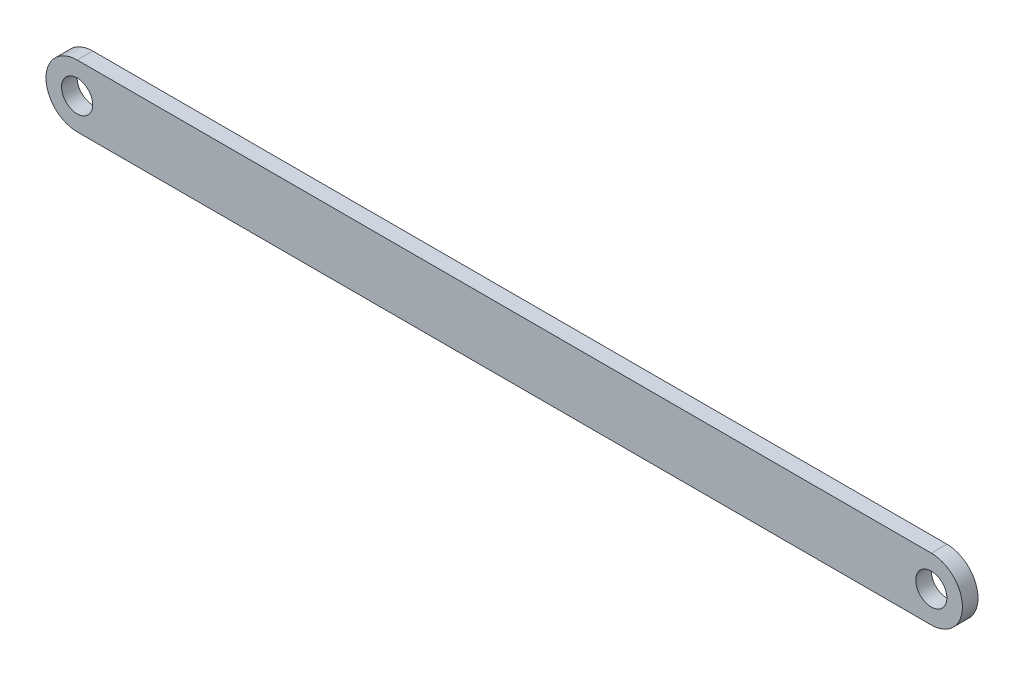
ISO-10303-21;
HEADER;
FILE_DESCRIPTION(('STEP AP214'),'2;1');
FILE_NAME('part.step','',(''),(''),'','','');
FILE_SCHEMA(('AUTOMOTIVE_DESIGN { 1 0 10303 214 1 1 1 1 }'));
ENDSEC;
DATA;
#1=APPLICATION_CONTEXT('core data for automotive mechanical design processes');
#2=APPLICATION_PROTOCOL_DEFINITION('international standard','automotive_design',2000,#1);
#3=PRODUCT_CONTEXT('',#1,'mechanical');
#4=PRODUCT('Part','Part','',(#3));
#5=PRODUCT_RELATED_PRODUCT_CATEGORY('part','',(#4));
#6=PRODUCT_DEFINITION_FORMATION('','',#4);
#7=PRODUCT_DEFINITION_CONTEXT('part definition',#1,'design');
#8=PRODUCT_DEFINITION('design','',#6,#7);
#9=PRODUCT_DEFINITION_SHAPE('','',#8);
#10=(LENGTH_UNIT() NAMED_UNIT(*) SI_UNIT(.MILLI.,.METRE.));
#11=(NAMED_UNIT(*) PLANE_ANGLE_UNIT() SI_UNIT($,.RADIAN.));
#12=(NAMED_UNIT(*) SI_UNIT($,.STERADIAN.) SOLID_ANGLE_UNIT());
#13=UNCERTAINTY_MEASURE_WITH_UNIT(LENGTH_MEASURE(1.E-05),#10,'distance_accuracy_value','');
#14=(GEOMETRIC_REPRESENTATION_CONTEXT(3) GLOBAL_UNCERTAINTY_ASSIGNED_CONTEXT((#13)) GLOBAL_UNIT_ASSIGNED_CONTEXT((#10,
#11,#12)) REPRESENTATION_CONTEXT('',''));
#15=CARTESIAN_POINT('',(0.,0.,0.));
#16=DIRECTION('',(0.,0.,1.));
#17=DIRECTION('',(1.,0.,0.));
#18=AXIS2_PLACEMENT_3D('',#15,#16,#17);
#19=CARTESIAN_POINT('',(27.435,0.,1.));
#20=DIRECTION('',(0.,0.,-1.));
#21=DIRECTION('',(-1.,0.,0.));
#22=AXIS2_PLACEMENT_3D('',#19,#20,#21);
#23=PLANE('',#22);
#24=CARTESIAN_POINT('',(27.435,0.,1.));
#25=DIRECTION('',(0.,0.,1.));
#26=DIRECTION('',(-1.,0.,0.));
#27=AXIS2_PLACEMENT_3D('',#24,#25,#26);
#28=CIRCLE('',#27,2.);
#29=CARTESIAN_POINT('',(27.435,-2.,1.));
#30=VERTEX_POINT('',#29);
#31=CARTESIAN_POINT('',(27.435,2.,1.));
#32=VERTEX_POINT('',#31);
#33=EDGE_CURVE('E96',#30,#32,#28,.T.);
#34=ORIENTED_EDGE('',*,*,#33,.T.);
#35=DIRECTION('',(-1.,0.,0.));
#36=VECTOR('',#35,1.);
#37=CARTESIAN_POINT('',(-27.435,2.,1.));
#38=LINE('',#37,#36);
#39=CARTESIAN_POINT('',(-27.435,2.,1.));
#40=VERTEX_POINT('',#39);
#41=EDGE_CURVE('E91',#32,#40,#38,.T.);
#42=ORIENTED_EDGE('',*,*,#41,.T.);
#43=CARTESIAN_POINT('',(-27.435,0.,1.));
#44=DIRECTION('',(0.,0.,1.));
#45=DIRECTION('',(1.,0.,0.));
#46=AXIS2_PLACEMENT_3D('',#43,#44,#45);
#47=CIRCLE('',#46,2.);
#48=CARTESIAN_POINT('',(-27.435,-2.,1.));
#49=VERTEX_POINT('',#48);
#50=EDGE_CURVE('E94',#40,#49,#47,.T.);
#51=ORIENTED_EDGE('',*,*,#50,.T.);
#52=DIRECTION('',(1.,0.,0.));
#53=VECTOR('',#52,1.);
#54=CARTESIAN_POINT('',(-27.435,-2.,1.));
#55=LINE('',#54,#53);
#56=EDGE_CURVE('E61',#49,#30,#55,.T.);
#57=ORIENTED_EDGE('',*,*,#56,.T.);
#58=EDGE_LOOP('',(#34,#42,#51,#57));
#59=FACE_BOUND('',#58,.T.);
#60=CARTESIAN_POINT('',(-27.435,0.,1.));
#61=DIRECTION('',(0.,0.,1.));
#62=DIRECTION('',(1.,0.,0.));
#63=AXIS2_PLACEMENT_3D('',#60,#61,#62);
#64=CIRCLE('',#63,1.);
#65=CARTESIAN_POINT('',(-26.435,0.,1.));
#66=VERTEX_POINT('',#65);
#67=EDGE_CURVE('E116',#66,#66,#64,.T.);
#68=ORIENTED_EDGE('',*,*,#67,.F.);
#69=EDGE_LOOP('',(#68));
#70=FACE_BOUND('',#69,.T.);
#71=CARTESIAN_POINT('',(27.435,0.,1.));
#72=DIRECTION('',(0.,0.,1.));
#73=DIRECTION('',(1.,0.,0.));
#74=AXIS2_PLACEMENT_3D('',#71,#72,#73);
#75=CIRCLE('',#74,1.);
#76=CARTESIAN_POINT('',(28.435,0.,1.));
#77=VERTEX_POINT('',#76);
#78=EDGE_CURVE('E138',#77,#77,#75,.T.);
#79=ORIENTED_EDGE('',*,*,#78,.F.);
#80=EDGE_LOOP('',(#79));
#81=FACE_BOUND('',#80,.T.);
#82=ADVANCED_FACE('F43',(#59,#70,#81),#23,.F.);
#83=CARTESIAN_POINT('',(27.435,0.,0.));
#84=DIRECTION('',(0.,0.,-1.));
#85=DIRECTION('',(-1.,0.,0.));
#86=AXIS2_PLACEMENT_3D('',#83,#84,#85);
#87=PLANE('',#86);
#88=CARTESIAN_POINT('',(-27.435,0.,0.));
#89=DIRECTION('',(0.,0.,1.));
#90=DIRECTION('',(1.,0.,0.));
#91=AXIS2_PLACEMENT_3D('',#88,#89,#90);
#92=CIRCLE('',#91,1.);
#93=CARTESIAN_POINT('',(-26.435,0.,0.));
#94=VERTEX_POINT('',#93);
#95=EDGE_CURVE('E134',#94,#94,#92,.T.);
#96=ORIENTED_EDGE('',*,*,#95,.T.);
#97=EDGE_LOOP('',(#96));
#98=FACE_BOUND('',#97,.T.);
#99=CARTESIAN_POINT('',(27.435,0.,0.));
#100=DIRECTION('',(0.,0.,1.));
#101=DIRECTION('',(-1.,0.,0.));
#102=AXIS2_PLACEMENT_3D('',#99,#100,#101);
#103=CIRCLE('',#102,2.);
#104=CARTESIAN_POINT('',(27.435,-2.,0.));
#105=VERTEX_POINT('',#104);
#106=CARTESIAN_POINT('',(27.435,2.,0.));
#107=VERTEX_POINT('',#106);
#108=EDGE_CURVE('E112',#105,#107,#103,.T.);
#109=ORIENTED_EDGE('',*,*,#108,.F.);
#110=DIRECTION('',(1.,0.,0.));
#111=VECTOR('',#110,1.);
#112=CARTESIAN_POINT('',(-27.435,-2.,0.));
#113=LINE('',#112,#111);
#114=CARTESIAN_POINT('',(-27.435,-2.,0.));
#115=VERTEX_POINT('',#114);
#116=EDGE_CURVE('E84',#115,#105,#113,.T.);
#117=ORIENTED_EDGE('',*,*,#116,.F.);
#118=CARTESIAN_POINT('',(-27.435,0.,0.));
#119=DIRECTION('',(0.,0.,1.));
#120=DIRECTION('',(1.,0.,0.));
#121=AXIS2_PLACEMENT_3D('',#118,#119,#120);
#122=CIRCLE('',#121,2.);
#123=CARTESIAN_POINT('',(-27.435,2.,0.));
#124=VERTEX_POINT('',#123);
#125=EDGE_CURVE('E78',#124,#115,#122,.T.);
#126=ORIENTED_EDGE('',*,*,#125,.F.);
#127=DIRECTION('',(-1.,0.,0.));
#128=VECTOR('',#127,1.);
#129=CARTESIAN_POINT('',(-27.435,2.,0.));
#130=LINE('',#129,#128);
#131=EDGE_CURVE('E101',#107,#124,#130,.T.);
#132=ORIENTED_EDGE('',*,*,#131,.F.);
#133=EDGE_LOOP('',(#109,#117,#126,#132));
#134=FACE_BOUND('',#133,.T.);
#135=CARTESIAN_POINT('',(27.435,0.,0.));
#136=DIRECTION('',(0.,0.,1.));
#137=DIRECTION('',(1.,0.,0.));
#138=AXIS2_PLACEMENT_3D('',#135,#136,#137);
#139=CIRCLE('',#138,1.);
#140=CARTESIAN_POINT('',(28.435,0.,0.));
#141=VERTEX_POINT('',#140);
#142=EDGE_CURVE('E142',#141,#141,#139,.T.);
#143=ORIENTED_EDGE('',*,*,#142,.T.);
#144=EDGE_LOOP('',(#143));
#145=FACE_BOUND('',#144,.T.);
#146=ADVANCED_FACE('F129',(#98,#134,#145),#87,.T.);
#147=CARTESIAN_POINT('',(27.435,0.,1.));
#148=DIRECTION('',(0.,0.,-1.));
#149=DIRECTION('',(-1.,0.,0.));
#150=AXIS2_PLACEMENT_3D('',#147,#148,#149);
#151=CYLINDRICAL_SURFACE('',#150,2.);
#152=ORIENTED_EDGE('',*,*,#108,.T.);
#153=DIRECTION('',(0.,0.,-1.));
#154=VECTOR('',#153,1.);
#155=CARTESIAN_POINT('',(27.435,2.,1.));
#156=LINE('',#155,#154);
#157=EDGE_CURVE('E11',#32,#107,#156,.T.);
#158=ORIENTED_EDGE('',*,*,#157,.F.);
#159=ORIENTED_EDGE('',*,*,#33,.F.);
#160=DIRECTION('',(0.,0.,-1.));
#161=VECTOR('',#160,1.);
#162=CARTESIAN_POINT('',(27.435,-2.,1.));
#163=LINE('',#162,#161);
#164=EDGE_CURVE('E108',#30,#105,#163,.T.);
#165=ORIENTED_EDGE('',*,*,#164,.T.);
#166=EDGE_LOOP('',(#152,#158,#159,#165));
#167=FACE_BOUND('',#166,.T.);
#168=ADVANCED_FACE('F45',(#167),#151,.T.);
#169=CARTESIAN_POINT('',(-27.435,2.,1.));
#170=DIRECTION('',(0.,-1.,0.));
#171=DIRECTION('',(0.,0.,-1.));
#172=AXIS2_PLACEMENT_3D('',#169,#170,#171);
#173=PLANE('',#172);
#174=ORIENTED_EDGE('',*,*,#131,.T.);
#175=DIRECTION('',(0.,0.,-1.));
#176=VECTOR('',#175,1.);
#177=CARTESIAN_POINT('',(-27.435,2.,1.));
#178=LINE('',#177,#176);
#179=EDGE_CURVE('E53',#40,#124,#178,.T.);
#180=ORIENTED_EDGE('',*,*,#179,.F.);
#181=ORIENTED_EDGE('',*,*,#41,.F.);
#182=ORIENTED_EDGE('',*,*,#157,.T.);
#183=EDGE_LOOP('',(#174,#180,#181,#182));
#184=FACE_BOUND('',#183,.T.);
#185=ADVANCED_FACE('F100',(#184),#173,.F.);
#186=CARTESIAN_POINT('',(-27.435,0.,1.));
#187=DIRECTION('',(0.,0.,-1.));
#188=DIRECTION('',(-1.,0.,0.));
#189=AXIS2_PLACEMENT_3D('',#186,#187,#188);
#190=CYLINDRICAL_SURFACE('',#189,2.);
#191=ORIENTED_EDGE('',*,*,#125,.T.);
#192=DIRECTION('',(0.,0.,-1.));
#193=VECTOR('',#192,1.);
#194=CARTESIAN_POINT('',(-27.435,-2.,1.));
#195=LINE('',#194,#193);
#196=EDGE_CURVE('E103',#49,#115,#195,.T.);
#197=ORIENTED_EDGE('',*,*,#196,.F.);
#198=ORIENTED_EDGE('',*,*,#50,.F.);
#199=ORIENTED_EDGE('',*,*,#179,.T.);
#200=EDGE_LOOP('',(#191,#197,#198,#199));
#201=FACE_BOUND('',#200,.T.);
#202=ADVANCED_FACE('F104',(#201),#190,.T.);
#203=CARTESIAN_POINT('',(-27.435,-2.,1.));
#204=DIRECTION('',(0.,1.,0.));
#205=DIRECTION('',(0.,0.,1.));
#206=AXIS2_PLACEMENT_3D('',#203,#204,#205);
#207=PLANE('',#206);
#208=ORIENTED_EDGE('',*,*,#116,.T.);
#209=ORIENTED_EDGE('',*,*,#164,.F.);
#210=ORIENTED_EDGE('',*,*,#56,.F.);
#211=ORIENTED_EDGE('',*,*,#196,.T.);
#212=EDGE_LOOP('',(#208,#209,#210,#211));
#213=FACE_BOUND('',#212,.T.);
#214=ADVANCED_FACE('F126',(#213),#207,.F.);
#215=CARTESIAN_POINT('',(-27.435,0.,1.));
#216=DIRECTION('',(0.,0.,-1.));
#217=DIRECTION('',(-1.,0.,0.));
#218=AXIS2_PLACEMENT_3D('',#215,#216,#217);
#219=CYLINDRICAL_SURFACE('',#218,1.);
#220=ORIENTED_EDGE('',*,*,#67,.T.);
#221=EDGE_LOOP('',(#220));
#222=FACE_BOUND('',#221,.T.);
#223=ORIENTED_EDGE('',*,*,#95,.F.);
#224=EDGE_LOOP('',(#223));
#225=FACE_BOUND('',#224,.T.);
#226=ADVANCED_FACE('F161',(#222,#225),#219,.F.);
#227=CARTESIAN_POINT('',(27.435,0.,1.));
#228=DIRECTION('',(0.,0.,-1.));
#229=DIRECTION('',(-1.,0.,0.));
#230=AXIS2_PLACEMENT_3D('',#227,#228,#229);
#231=CYLINDRICAL_SURFACE('',#230,1.);
#232=ORIENTED_EDGE('',*,*,#78,.T.);
#233=EDGE_LOOP('',(#232));
#234=FACE_BOUND('',#233,.T.);
#235=ORIENTED_EDGE('',*,*,#142,.F.);
#236=EDGE_LOOP('',(#235));
#237=FACE_BOUND('',#236,.T.);
#238=ADVANCED_FACE('F150',(#234,#237),#231,.F.);
#239=CLOSED_SHELL('',(#82,#146,#168,#185,#202,#214,#226,#238));
#240=MANIFOLD_SOLID_BREP('B2',#239);
#241=ADVANCED_BREP_SHAPE_REPRESENTATION('',(#18,#240),#14);
#242=SHAPE_DEFINITION_REPRESENTATION(#9,#241);
ENDSEC;
END-ISO-10303-21;
